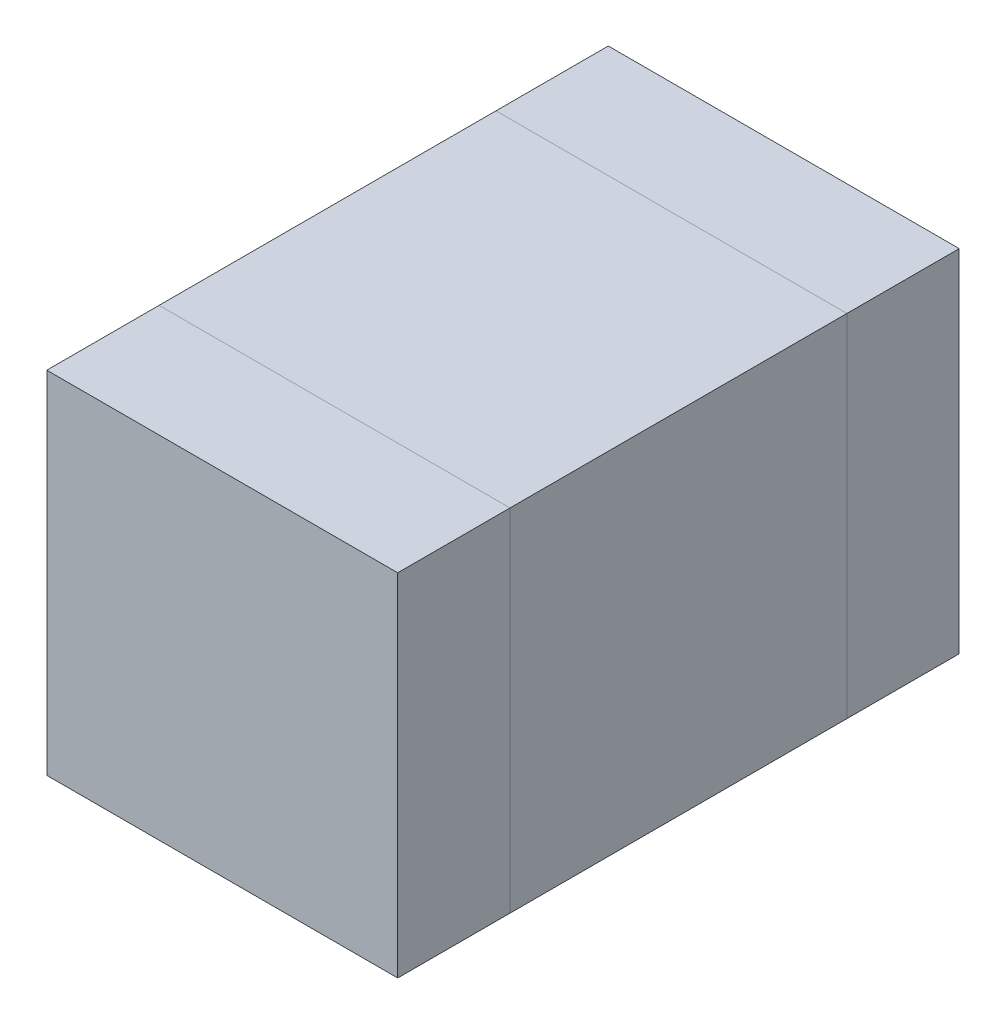
ISO-10303-21;
HEADER;
FILE_DESCRIPTION(('STEP AP214'),'2;1');
FILE_NAME('part.step','',(''),(''),'','','');
FILE_SCHEMA(('AUTOMOTIVE_DESIGN { 1 0 10303 214 1 1 1 1 }'));
ENDSEC;
DATA;
#1=APPLICATION_CONTEXT('core data for automotive mechanical design processes');
#2=APPLICATION_PROTOCOL_DEFINITION('international standard','automotive_design',2000,#1);
#3=PRODUCT_CONTEXT('',#1,'mechanical');
#4=PRODUCT('Part','Part','',(#3));
#5=PRODUCT_RELATED_PRODUCT_CATEGORY('part','',(#4));
#6=PRODUCT_DEFINITION_FORMATION('','',#4);
#7=PRODUCT_DEFINITION_CONTEXT('part definition',#1,'design');
#8=PRODUCT_DEFINITION('design','',#6,#7);
#9=PRODUCT_DEFINITION_SHAPE('','',#8);
#10=(LENGTH_UNIT() NAMED_UNIT(*) SI_UNIT(.MILLI.,.METRE.));
#11=(NAMED_UNIT(*) PLANE_ANGLE_UNIT() SI_UNIT($,.RADIAN.));
#12=(NAMED_UNIT(*) SI_UNIT($,.STERADIAN.) SOLID_ANGLE_UNIT());
#13=UNCERTAINTY_MEASURE_WITH_UNIT(LENGTH_MEASURE(1.E-05),#10,'distance_accuracy_value','');
#14=(GEOMETRIC_REPRESENTATION_CONTEXT(3) GLOBAL_UNCERTAINTY_ASSIGNED_CONTEXT((#13)) GLOBAL_UNIT_ASSIGNED_CONTEXT((#10,
#11,#12)) REPRESENTATION_CONTEXT('',''));
#15=CARTESIAN_POINT('',(0.,0.,0.));
#16=DIRECTION('',(0.,0.,1.));
#17=DIRECTION('',(1.,0.,0.));
#18=AXIS2_PLACEMENT_3D('',#15,#16,#17);
#19=CARTESIAN_POINT('',(0.,0.,0.));
#20=DIRECTION('',(0.,1.,0.));
#21=DIRECTION('',(1.,0.,0.));
#22=AXIS2_PLACEMENT_3D('',#19,#20,#21);
#23=PLANE('',#22);
#24=DIRECTION('',(0.,0.,-1.));
#25=VECTOR('',#24,1.);
#26=CARTESIAN_POINT('',(0.625,0.,-0.6));
#27=LINE('',#26,#25);
#28=CARTESIAN_POINT('',(0.625,0.,0.6));
#29=VERTEX_POINT('',#28);
#30=CARTESIAN_POINT('',(0.625,0.,-0.6));
#31=VERTEX_POINT('',#30);
#32=EDGE_CURVE('P0_E80',#29,#31,#27,.T.);
#33=ORIENTED_EDGE('',*,*,#32,.F.);
#34=DIRECTION('',(1.,0.,0.));
#35=VECTOR('',#34,1.);
#36=CARTESIAN_POINT('',(-0.625,0.,0.6));
#37=LINE('',#36,#35);
#38=CARTESIAN_POINT('',(-0.625,0.,0.6));
#39=VERTEX_POINT('',#38);
#40=EDGE_CURVE('P0_E27',#39,#29,#37,.T.);
#41=ORIENTED_EDGE('',*,*,#40,.F.);
#42=DIRECTION('',(0.,0.,1.));
#43=VECTOR('',#42,1.);
#44=CARTESIAN_POINT('',(-0.625,0.,-0.6));
#45=LINE('',#44,#43);
#46=CARTESIAN_POINT('',(-0.625,0.,-0.6));
#47=VERTEX_POINT('',#46);
#48=EDGE_CURVE('P0_E59',#47,#39,#45,.T.);
#49=ORIENTED_EDGE('',*,*,#48,.F.);
#50=DIRECTION('',(-1.,0.,0.));
#51=VECTOR('',#50,1.);
#52=CARTESIAN_POINT('',(-0.625,0.,-0.6));
#53=LINE('',#52,#51);
#54=EDGE_CURVE('P0_E77',#31,#47,#53,.T.);
#55=ORIENTED_EDGE('',*,*,#54,.F.);
#56=EDGE_LOOP('',(#33,#41,#49,#55));
#57=FACE_BOUND('',#56,.T.);
#58=ADVANCED_FACE('P0_F17',(#57),#23,.F.);
#59=CARTESIAN_POINT('',(0.,1.25,0.));
#60=DIRECTION('',(0.,1.,0.));
#61=DIRECTION('',(1.,0.,0.));
#62=AXIS2_PLACEMENT_3D('',#59,#60,#61);
#63=PLANE('',#62);
#64=DIRECTION('',(0.,0.,-1.));
#65=VECTOR('',#64,1.);
#66=CARTESIAN_POINT('',(0.625,1.25,-0.6));
#67=LINE('',#66,#65);
#68=CARTESIAN_POINT('',(0.625,1.25,0.6));
#69=VERTEX_POINT('',#68);
#70=CARTESIAN_POINT('',(0.625,1.25,-0.6));
#71=VERTEX_POINT('',#70);
#72=EDGE_CURVE('P0_E95',#69,#71,#67,.T.);
#73=ORIENTED_EDGE('',*,*,#72,.T.);
#74=DIRECTION('',(-1.,0.,0.));
#75=VECTOR('',#74,1.);
#76=CARTESIAN_POINT('',(-0.625,1.25,-0.6));
#77=LINE('',#76,#75);
#78=CARTESIAN_POINT('',(-0.625,1.25,-0.6));
#79=VERTEX_POINT('',#78);
#80=EDGE_CURVE('P0_E90',#71,#79,#77,.T.);
#81=ORIENTED_EDGE('',*,*,#80,.T.);
#82=DIRECTION('',(0.,0.,1.));
#83=VECTOR('',#82,1.);
#84=CARTESIAN_POINT('',(-0.625,1.25,-0.6));
#85=LINE('',#84,#83);
#86=CARTESIAN_POINT('',(-0.625,1.25,0.6));
#87=VERTEX_POINT('',#86);
#88=EDGE_CURVE('P0_E20',#79,#87,#85,.T.);
#89=ORIENTED_EDGE('',*,*,#88,.T.);
#90=DIRECTION('',(1.,0.,0.));
#91=VECTOR('',#90,1.);
#92=CARTESIAN_POINT('',(-0.625,1.25,0.6));
#93=LINE('',#92,#91);
#94=EDGE_CURVE('P0_E11',#87,#69,#93,.T.);
#95=ORIENTED_EDGE('',*,*,#94,.T.);
#96=EDGE_LOOP('',(#73,#81,#89,#95));
#97=FACE_BOUND('',#96,.T.);
#98=ADVANCED_FACE('P0_F123',(#97),#63,.T.);
#99=CARTESIAN_POINT('',(-0.625,1.25,0.6));
#100=DIRECTION('',(0.,0.,-1.));
#101=DIRECTION('',(0.,-1.,0.));
#102=AXIS2_PLACEMENT_3D('',#99,#100,#101);
#103=PLANE('',#102);
#104=ORIENTED_EDGE('',*,*,#40,.T.);
#105=DIRECTION('',(0.,-1.,0.));
#106=VECTOR('',#105,1.);
#107=CARTESIAN_POINT('',(0.625,1.25,0.6));
#108=LINE('',#107,#106);
#109=EDGE_CURVE('P0_E85',#69,#29,#108,.T.);
#110=ORIENTED_EDGE('',*,*,#109,.F.);
#111=ORIENTED_EDGE('',*,*,#94,.F.);
#112=DIRECTION('',(0.,-1.,0.));
#113=VECTOR('',#112,1.);
#114=CARTESIAN_POINT('',(-0.625,1.25,0.6));
#115=LINE('',#114,#113);
#116=EDGE_CURVE('P0_E106',#87,#39,#115,.T.);
#117=ORIENTED_EDGE('',*,*,#116,.T.);
#118=EDGE_LOOP('',(#104,#110,#111,#117));
#119=FACE_BOUND('',#118,.T.);
#120=ADVANCED_FACE('P0_F126',(#119),#103,.F.);
#121=CARTESIAN_POINT('',(-0.625,1.25,-0.6));
#122=DIRECTION('',(1.,0.,0.));
#123=DIRECTION('',(0.,0.,-1.));
#124=AXIS2_PLACEMENT_3D('',#121,#122,#123);
#125=PLANE('',#124);
#126=ORIENTED_EDGE('',*,*,#48,.T.);
#127=ORIENTED_EDGE('',*,*,#116,.F.);
#128=ORIENTED_EDGE('',*,*,#88,.F.);
#129=DIRECTION('',(0.,-1.,0.));
#130=VECTOR('',#129,1.);
#131=CARTESIAN_POINT('',(-0.625,1.25,-0.6));
#132=LINE('',#131,#130);
#133=EDGE_CURVE('P0_E84',#79,#47,#132,.T.);
#134=ORIENTED_EDGE('',*,*,#133,.T.);
#135=EDGE_LOOP('',(#126,#127,#128,#134));
#136=FACE_BOUND('',#135,.T.);
#137=ADVANCED_FACE('P0_F124',(#136),#125,.F.);
#138=CARTESIAN_POINT('',(-0.625,1.25,-0.6));
#139=DIRECTION('',(0.,0.,1.));
#140=DIRECTION('',(1.,0.,0.));
#141=AXIS2_PLACEMENT_3D('',#138,#139,#140);
#142=PLANE('',#141);
#143=ORIENTED_EDGE('',*,*,#54,.T.);
#144=ORIENTED_EDGE('',*,*,#133,.F.);
#145=ORIENTED_EDGE('',*,*,#80,.F.);
#146=DIRECTION('',(0.,-1.,0.));
#147=VECTOR('',#146,1.);
#148=CARTESIAN_POINT('',(0.625,1.25,-0.6));
#149=LINE('',#148,#147);
#150=EDGE_CURVE('P0_E88',#71,#31,#149,.T.);
#151=ORIENTED_EDGE('',*,*,#150,.T.);
#152=EDGE_LOOP('',(#143,#144,#145,#151));
#153=FACE_BOUND('',#152,.T.);
#154=ADVANCED_FACE('P0_F89',(#153),#142,.F.);
#155=CARTESIAN_POINT('',(0.625,1.25,-0.6));
#156=DIRECTION('',(-1.,0.,0.));
#157=DIRECTION('',(0.,1.,0.));
#158=AXIS2_PLACEMENT_3D('',#155,#156,#157);
#159=PLANE('',#158);
#160=ORIENTED_EDGE('',*,*,#32,.T.);
#161=ORIENTED_EDGE('',*,*,#150,.F.);
#162=ORIENTED_EDGE('',*,*,#72,.F.);
#163=ORIENTED_EDGE('',*,*,#109,.T.);
#164=EDGE_LOOP('',(#160,#161,#162,#163));
#165=FACE_BOUND('',#164,.T.);
#166=ADVANCED_FACE('P0_F97',(#165),#159,.F.);
#167=CLOSED_SHELL('',(#58,#98,#120,#137,#154,#166));
#168=MANIFOLD_SOLID_BREP('P0_B1',#167);
#169=CARTESIAN_POINT('',(-0.625,2.562440474841,0.6));
#170=DIRECTION('',(-1.,0.,0.));
#171=DIRECTION('',(0.,1.,0.));
#172=AXIS2_PLACEMENT_3D('',#169,#170,#171);
#173=PLANE('',#172);
#174=DIRECTION('',(0.,-1.,0.));
#175=VECTOR('',#174,1.);
#176=CARTESIAN_POINT('',(-0.625,2.562440474841,1.));
#177=LINE('',#176,#175);
#178=CARTESIAN_POINT('',(-0.625,1.25,1.));
#179=VERTEX_POINT('',#178);
#180=CARTESIAN_POINT('',(-0.625,0.,1.));
#181=VERTEX_POINT('',#180);
#182=EDGE_CURVE('P1_E11',#179,#181,#177,.T.);
#183=ORIENTED_EDGE('',*,*,#182,.F.);
#184=DIRECTION('',(0.,0.,-1.));
#185=VECTOR('',#184,1.);
#186=CARTESIAN_POINT('',(-0.625,1.25,0.6));
#187=LINE('',#186,#185);
#188=CARTESIAN_POINT('',(-0.625,1.25,0.6));
#189=VERTEX_POINT('',#188);
#190=EDGE_CURVE('P1_E73',#179,#189,#187,.T.);
#191=ORIENTED_EDGE('',*,*,#190,.T.);
#192=DIRECTION('',(0.,-1.,0.));
#193=VECTOR('',#192,1.);
#194=CARTESIAN_POINT('',(-0.625,2.562440474841,0.6));
#195=LINE('',#194,#193);
#196=CARTESIAN_POINT('',(-0.625,0.,0.6));
#197=VERTEX_POINT('',#196);
#198=EDGE_CURVE('P1_E93',#189,#197,#195,.T.);
#199=ORIENTED_EDGE('',*,*,#198,.T.);
#200=DIRECTION('',(0.,0.,-1.));
#201=VECTOR('',#200,1.);
#202=CARTESIAN_POINT('',(-0.625,0.,0.6));
#203=LINE('',#202,#201);
#204=EDGE_CURVE('P1_E75',#181,#197,#203,.T.);
#205=ORIENTED_EDGE('',*,*,#204,.F.);
#206=EDGE_LOOP('',(#183,#191,#199,#205));
#207=FACE_BOUND('',#206,.T.);
#208=ADVANCED_FACE('P1_F17',(#207),#173,.T.);
#209=CARTESIAN_POINT('',(-0.625,2.562440474841,1.));
#210=DIRECTION('',(0.,0.,1.));
#211=DIRECTION('',(1.,0.,0.));
#212=AXIS2_PLACEMENT_3D('',#209,#210,#211);
#213=PLANE('',#212);
#214=DIRECTION('',(0.,-1.,0.));
#215=VECTOR('',#214,1.);
#216=CARTESIAN_POINT('',(0.625,2.562440474841,1.));
#217=LINE('',#216,#215);
#218=CARTESIAN_POINT('',(0.625,1.25,1.));
#219=VERTEX_POINT('',#218);
#220=CARTESIAN_POINT('',(0.625,0.,1.));
#221=VERTEX_POINT('',#220);
#222=EDGE_CURVE('P1_E25',#219,#221,#217,.T.);
#223=ORIENTED_EDGE('',*,*,#222,.F.);
#224=DIRECTION('',(-1.,0.,0.));
#225=VECTOR('',#224,1.);
#226=CARTESIAN_POINT('',(-0.625,1.25,1.));
#227=LINE('',#226,#225);
#228=EDGE_CURVE('P1_E79',#219,#179,#227,.T.);
#229=ORIENTED_EDGE('',*,*,#228,.T.);
#230=ORIENTED_EDGE('',*,*,#182,.T.);
#231=DIRECTION('',(-1.,0.,0.));
#232=VECTOR('',#231,1.);
#233=CARTESIAN_POINT('',(-0.625,0.,1.));
#234=LINE('',#233,#232);
#235=EDGE_CURVE('P1_E96',#221,#181,#234,.T.);
#236=ORIENTED_EDGE('',*,*,#235,.F.);
#237=EDGE_LOOP('',(#223,#229,#230,#236));
#238=FACE_BOUND('',#237,.T.);
#239=ADVANCED_FACE('P1_F80',(#238),#213,.T.);
#240=CARTESIAN_POINT('',(0.625,2.562440474841,0.6));
#241=DIRECTION('',(1.,0.,0.));
#242=DIRECTION('',(0.,0.,1.));
#243=AXIS2_PLACEMENT_3D('',#240,#241,#242);
#244=PLANE('',#243);
#245=DIRECTION('',(0.,-1.,0.));
#246=VECTOR('',#245,1.);
#247=CARTESIAN_POINT('',(0.625,2.562440474841,0.6));
#248=LINE('',#247,#246);
#249=CARTESIAN_POINT('',(0.625,1.25,0.6));
#250=VERTEX_POINT('',#249);
#251=CARTESIAN_POINT('',(0.625,0.,0.6));
#252=VERTEX_POINT('',#251);
#253=EDGE_CURVE('P1_E46',#250,#252,#248,.T.);
#254=ORIENTED_EDGE('',*,*,#253,.F.);
#255=DIRECTION('',(0.,0.,1.));
#256=VECTOR('',#255,1.);
#257=CARTESIAN_POINT('',(0.625,1.25,0.6));
#258=LINE('',#257,#256);
#259=EDGE_CURVE('P1_E84',#250,#219,#258,.T.);
#260=ORIENTED_EDGE('',*,*,#259,.T.);
#261=ORIENTED_EDGE('',*,*,#222,.T.);
#262=DIRECTION('',(0.,0.,1.));
#263=VECTOR('',#262,1.);
#264=CARTESIAN_POINT('',(0.625,0.,0.6));
#265=LINE('',#264,#263);
#266=EDGE_CURVE('P1_E97',#252,#221,#265,.T.);
#267=ORIENTED_EDGE('',*,*,#266,.F.);
#268=EDGE_LOOP('',(#254,#260,#261,#267));
#269=FACE_BOUND('',#268,.T.);
#270=ADVANCED_FACE('P1_F143',(#269),#244,.T.);
#271=CARTESIAN_POINT('',(-0.625,2.562440474841,0.6));
#272=DIRECTION('',(0.,0.,-1.));
#273=DIRECTION('',(0.,-1.,0.));
#274=AXIS2_PLACEMENT_3D('',#271,#272,#273);
#275=PLANE('',#274);
#276=ORIENTED_EDGE('',*,*,#198,.F.);
#277=DIRECTION('',(1.,0.,0.));
#278=VECTOR('',#277,1.);
#279=CARTESIAN_POINT('',(-0.625,1.25,0.6));
#280=LINE('',#279,#278);
#281=EDGE_CURVE('P1_E88',#189,#250,#280,.T.);
#282=ORIENTED_EDGE('',*,*,#281,.T.);
#283=ORIENTED_EDGE('',*,*,#253,.T.);
#284=DIRECTION('',(1.,0.,0.));
#285=VECTOR('',#284,1.);
#286=CARTESIAN_POINT('',(-0.625,0.,0.6));
#287=LINE('',#286,#285);
#288=EDGE_CURVE('P1_E101',#197,#252,#287,.T.);
#289=ORIENTED_EDGE('',*,*,#288,.F.);
#290=EDGE_LOOP('',(#276,#282,#283,#289));
#291=FACE_BOUND('',#290,.T.);
#292=ADVANCED_FACE('P1_F134',(#291),#275,.T.);
#293=CARTESIAN_POINT('',(0.,0.,0.));
#294=DIRECTION('',(0.,1.,0.));
#295=DIRECTION('',(1.,0.,0.));
#296=AXIS2_PLACEMENT_3D('',#293,#294,#295);
#297=PLANE('',#296);
#298=ORIENTED_EDGE('',*,*,#204,.T.);
#299=ORIENTED_EDGE('',*,*,#288,.T.);
#300=ORIENTED_EDGE('',*,*,#266,.T.);
#301=ORIENTED_EDGE('',*,*,#235,.T.);
#302=EDGE_LOOP('',(#298,#299,#300,#301));
#303=FACE_BOUND('',#302,.T.);
#304=ADVANCED_FACE('P1_F125',(#303),#297,.F.);
#305=CARTESIAN_POINT('',(0.,1.25,0.));
#306=DIRECTION('',(0.,1.,0.));
#307=DIRECTION('',(1.,0.,0.));
#308=AXIS2_PLACEMENT_3D('',#305,#306,#307);
#309=PLANE('',#308);
#310=ORIENTED_EDGE('',*,*,#190,.F.);
#311=ORIENTED_EDGE('',*,*,#228,.F.);
#312=ORIENTED_EDGE('',*,*,#259,.F.);
#313=ORIENTED_EDGE('',*,*,#281,.F.);
#314=EDGE_LOOP('',(#310,#311,#312,#313));
#315=FACE_BOUND('',#314,.T.);
#316=ADVANCED_FACE('P1_F87',(#315),#309,.T.);
#317=CLOSED_SHELL('',(#208,#239,#270,#292,#304,#316));
#318=MANIFOLD_SOLID_BREP('P1_B1',#317);
#319=CARTESIAN_POINT('',(-0.625,2.562440474841,-0.6));
#320=DIRECTION('',(-1.,0.,0.));
#321=DIRECTION('',(0.,0.,1.));
#322=AXIS2_PLACEMENT_3D('',#319,#320,#321);
#323=PLANE('',#322);
#324=DIRECTION('',(0.,-1.,0.));
#325=VECTOR('',#324,1.);
#326=CARTESIAN_POINT('',(-0.625,2.562440474841,-0.6));
#327=LINE('',#326,#325);
#328=CARTESIAN_POINT('',(-0.625,1.25,-0.6));
#329=VERTEX_POINT('',#328);
#330=CARTESIAN_POINT('',(-0.625,0.,-0.6));
#331=VERTEX_POINT('',#330);
#332=EDGE_CURVE('P2_E11',#329,#331,#327,.T.);
#333=ORIENTED_EDGE('',*,*,#332,.F.);
#334=DIRECTION('',(0.,0.,-1.));
#335=VECTOR('',#334,1.);
#336=CARTESIAN_POINT('',(-0.625,1.25,-0.6));
#337=LINE('',#336,#335);
#338=CARTESIAN_POINT('',(-0.625,1.25,-1.));
#339=VERTEX_POINT('',#338);
#340=EDGE_CURVE('P2_E73',#329,#339,#337,.T.);
#341=ORIENTED_EDGE('',*,*,#340,.T.);
#342=DIRECTION('',(0.,-1.,0.));
#343=VECTOR('',#342,1.);
#344=CARTESIAN_POINT('',(-0.625,2.562440474841,-1.));
#345=LINE('',#344,#343);
#346=CARTESIAN_POINT('',(-0.625,0.,-1.));
#347=VERTEX_POINT('',#346);
#348=EDGE_CURVE('P2_E109',#339,#347,#345,.T.);
#349=ORIENTED_EDGE('',*,*,#348,.T.);
#350=DIRECTION('',(0.,0.,-1.));
#351=VECTOR('',#350,1.);
#352=CARTESIAN_POINT('',(-0.625,0.,-0.6));
#353=LINE('',#352,#351);
#354=EDGE_CURVE('P2_E75',#331,#347,#353,.T.);
#355=ORIENTED_EDGE('',*,*,#354,.F.);
#356=EDGE_LOOP('',(#333,#341,#349,#355));
#357=FACE_BOUND('',#356,.T.);
#358=ADVANCED_FACE('P2_F17',(#357),#323,.T.);
#359=CARTESIAN_POINT('',(-0.625,2.562440474841,-0.6));
#360=DIRECTION('',(0.,0.,1.));
#361=DIRECTION('',(1.,0.,0.));
#362=AXIS2_PLACEMENT_3D('',#359,#360,#361);
#363=PLANE('',#362);
#364=DIRECTION('',(0.,-1.,0.));
#365=VECTOR('',#364,1.);
#366=CARTESIAN_POINT('',(0.625,2.562440474841,-0.6));
#367=LINE('',#366,#365);
#368=CARTESIAN_POINT('',(0.625,1.25,-0.6));
#369=VERTEX_POINT('',#368);
#370=CARTESIAN_POINT('',(0.625,0.,-0.6));
#371=VERTEX_POINT('',#370);
#372=EDGE_CURVE('P2_E25',#369,#371,#367,.T.);
#373=ORIENTED_EDGE('',*,*,#372,.F.);
#374=DIRECTION('',(-1.,0.,0.));
#375=VECTOR('',#374,1.);
#376=CARTESIAN_POINT('',(-0.625,1.25,-0.6));
#377=LINE('',#376,#375);
#378=EDGE_CURVE('P2_E79',#369,#329,#377,.T.);
#379=ORIENTED_EDGE('',*,*,#378,.T.);
#380=ORIENTED_EDGE('',*,*,#332,.T.);
#381=DIRECTION('',(-1.,0.,0.));
#382=VECTOR('',#381,1.);
#383=CARTESIAN_POINT('',(-0.625,0.,-0.6));
#384=LINE('',#383,#382);
#385=EDGE_CURVE('P2_E106',#371,#331,#384,.T.);
#386=ORIENTED_EDGE('',*,*,#385,.F.);
#387=EDGE_LOOP('',(#373,#379,#380,#386));
#388=FACE_BOUND('',#387,.T.);
#389=ADVANCED_FACE('P2_F80',(#388),#363,.T.);
#390=CARTESIAN_POINT('',(0.625,2.562440474841,-0.6));
#391=DIRECTION('',(1.,0.,0.));
#392=DIRECTION('',(0.,0.,1.));
#393=AXIS2_PLACEMENT_3D('',#390,#391,#392);
#394=PLANE('',#393);
#395=DIRECTION('',(0.,-1.,0.));
#396=VECTOR('',#395,1.);
#397=CARTESIAN_POINT('',(0.625,2.562440474841,-1.));
#398=LINE('',#397,#396);
#399=CARTESIAN_POINT('',(0.625,1.25,-1.));
#400=VERTEX_POINT('',#399);
#401=CARTESIAN_POINT('',(0.625,0.,-1.));
#402=VERTEX_POINT('',#401);
#403=EDGE_CURVE('P2_E46',#400,#402,#398,.T.);
#404=ORIENTED_EDGE('',*,*,#403,.F.);
#405=DIRECTION('',(0.,0.,1.));
#406=VECTOR('',#405,1.);
#407=CARTESIAN_POINT('',(0.625,1.25,-0.6));
#408=LINE('',#407,#406);
#409=EDGE_CURVE('P2_E84',#400,#369,#408,.T.);
#410=ORIENTED_EDGE('',*,*,#409,.T.);
#411=ORIENTED_EDGE('',*,*,#372,.T.);
#412=DIRECTION('',(0.,0.,1.));
#413=VECTOR('',#412,1.);
#414=CARTESIAN_POINT('',(0.625,0.,-0.6));
#415=LINE('',#414,#413);
#416=EDGE_CURVE('P2_E94',#402,#371,#415,.T.);
#417=ORIENTED_EDGE('',*,*,#416,.F.);
#418=EDGE_LOOP('',(#404,#410,#411,#417));
#419=FACE_BOUND('',#418,.T.);
#420=ADVANCED_FACE('P2_F142',(#419),#394,.T.);
#421=CARTESIAN_POINT('',(-0.625,2.562440474841,-1.));
#422=DIRECTION('',(0.,0.,-1.));
#423=DIRECTION('',(0.,-1.,0.));
#424=AXIS2_PLACEMENT_3D('',#421,#422,#423);
#425=PLANE('',#424);
#426=ORIENTED_EDGE('',*,*,#348,.F.);
#427=DIRECTION('',(1.,0.,0.));
#428=VECTOR('',#427,1.);
#429=CARTESIAN_POINT('',(-0.625,1.25,-1.));
#430=LINE('',#429,#428);
#431=EDGE_CURVE('P2_E88',#339,#400,#430,.T.);
#432=ORIENTED_EDGE('',*,*,#431,.T.);
#433=ORIENTED_EDGE('',*,*,#403,.T.);
#434=DIRECTION('',(1.,0.,0.));
#435=VECTOR('',#434,1.);
#436=CARTESIAN_POINT('',(-0.625,0.,-1.));
#437=LINE('',#436,#435);
#438=EDGE_CURVE('P2_E100',#347,#402,#437,.T.);
#439=ORIENTED_EDGE('',*,*,#438,.F.);
#440=EDGE_LOOP('',(#426,#432,#433,#439));
#441=FACE_BOUND('',#440,.T.);
#442=ADVANCED_FACE('P2_F125',(#441),#425,.T.);
#443=CARTESIAN_POINT('',(0.,0.,0.));
#444=DIRECTION('',(0.,-1.,0.));
#445=DIRECTION('',(0.,0.,-1.));
#446=AXIS2_PLACEMENT_3D('',#443,#444,#445);
#447=PLANE('',#446);
#448=ORIENTED_EDGE('',*,*,#354,.T.);
#449=ORIENTED_EDGE('',*,*,#438,.T.);
#450=ORIENTED_EDGE('',*,*,#416,.T.);
#451=ORIENTED_EDGE('',*,*,#385,.T.);
#452=EDGE_LOOP('',(#448,#449,#450,#451));
#453=FACE_BOUND('',#452,.T.);
#454=ADVANCED_FACE('P2_F120',(#453),#447,.T.);
#455=CARTESIAN_POINT('',(0.,1.25,0.));
#456=DIRECTION('',(0.,1.,0.));
#457=DIRECTION('',(1.,0.,0.));
#458=AXIS2_PLACEMENT_3D('',#455,#456,#457);
#459=PLANE('',#458);
#460=ORIENTED_EDGE('',*,*,#340,.F.);
#461=ORIENTED_EDGE('',*,*,#378,.F.);
#462=ORIENTED_EDGE('',*,*,#409,.F.);
#463=ORIENTED_EDGE('',*,*,#431,.F.);
#464=EDGE_LOOP('',(#460,#461,#462,#463));
#465=FACE_BOUND('',#464,.T.);
#466=ADVANCED_FACE('P2_F87',(#465),#459,.T.);
#467=CLOSED_SHELL('',(#358,#389,#420,#442,#454,#466));
#468=MANIFOLD_SOLID_BREP('P2_B1',#467);
#469=ADVANCED_BREP_SHAPE_REPRESENTATION('',(#18,#168,#318,#468),#14);
#470=SHAPE_DEFINITION_REPRESENTATION(#9,#469);
ENDSEC;
END-ISO-10303-21;
